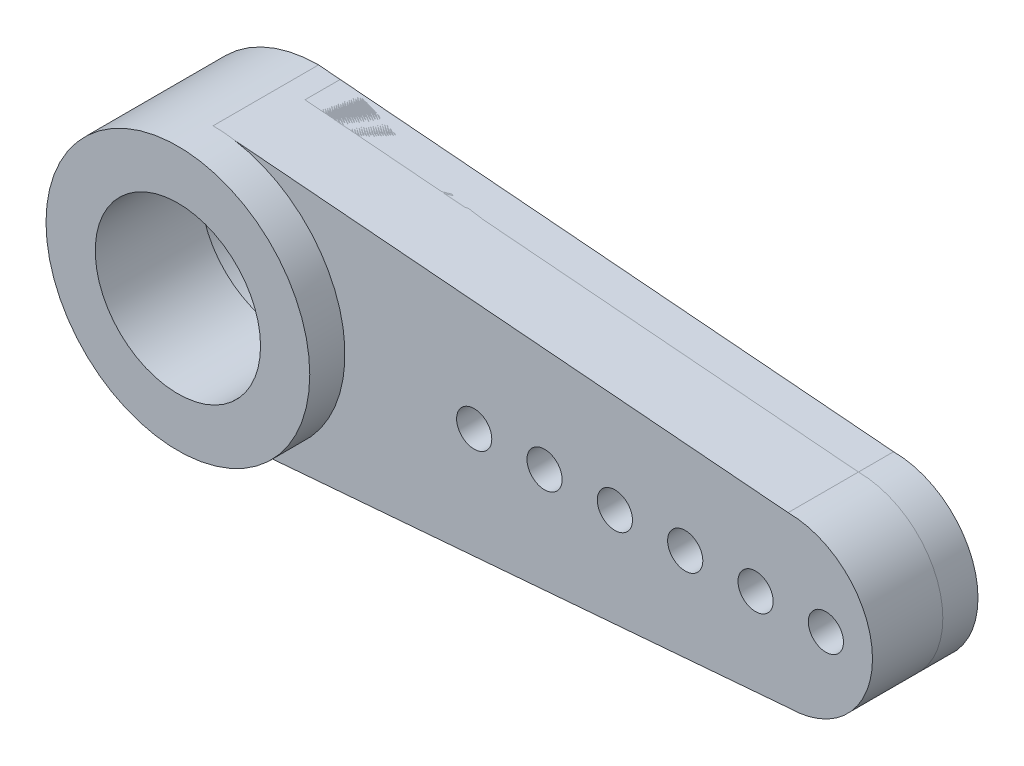
ISO-10303-21;
HEADER;
FILE_DESCRIPTION(('STEP AP214'),'2;1');
FILE_NAME('part.step','',(''),(''),'','','');
FILE_SCHEMA(('AUTOMOTIVE_DESIGN { 1 0 10303 214 1 1 1 1 }'));
ENDSEC;
DATA;
#1=APPLICATION_CONTEXT('core data for automotive mechanical design processes');
#2=APPLICATION_PROTOCOL_DEFINITION('international standard','automotive_design',2000,#1);
#3=PRODUCT_CONTEXT('',#1,'mechanical');
#4=PRODUCT('Part','Part','',(#3));
#5=PRODUCT_RELATED_PRODUCT_CATEGORY('part','',(#4));
#6=PRODUCT_DEFINITION_FORMATION('','',#4);
#7=PRODUCT_DEFINITION_CONTEXT('part definition',#1,'design');
#8=PRODUCT_DEFINITION('design','',#6,#7);
#9=PRODUCT_DEFINITION_SHAPE('','',#8);
#10=(LENGTH_UNIT() NAMED_UNIT(*) SI_UNIT(.MILLI.,.METRE.));
#11=(NAMED_UNIT(*) PLANE_ANGLE_UNIT() SI_UNIT($,.RADIAN.));
#12=(NAMED_UNIT(*) SI_UNIT($,.STERADIAN.) SOLID_ANGLE_UNIT());
#13=UNCERTAINTY_MEASURE_WITH_UNIT(LENGTH_MEASURE(1.E-05),#10,'distance_accuracy_value','');
#14=(GEOMETRIC_REPRESENTATION_CONTEXT(3) GLOBAL_UNCERTAINTY_ASSIGNED_CONTEXT((#13)) GLOBAL_UNIT_ASSIGNED_CONTEXT((#10,
#11,#12)) REPRESENTATION_CONTEXT('',''));
#15=CARTESIAN_POINT('',(0.,0.,0.));
#16=DIRECTION('',(0.,0.,1.));
#17=DIRECTION('',(1.,0.,0.));
#18=AXIS2_PLACEMENT_3D('',#15,#16,#17);
#19=CARTESIAN_POINT('',(2.83275381664821,0.,-20.5860238237002));
#20=DIRECTION('',(0.,0.,1.));
#21=DIRECTION('',(1.,0.,0.));
#22=AXIS2_PLACEMENT_3D('',#19,#20,#21);
#23=CYLINDRICAL_SURFACE('',#22,0.500000000000001);
#24=CARTESIAN_POINT('',(2.83275381664821,0.,0.));
#25=DIRECTION('',(0.,0.,-1.));
#26=DIRECTION('',(-1.,0.,0.));
#27=AXIS2_PLACEMENT_3D('',#24,#25,#26);
#28=CIRCLE('',#27,0.500000000000001);
#29=CARTESIAN_POINT('',(2.33275381664821,0.,0.));
#30=VERTEX_POINT('',#29);
#31=EDGE_CURVE('E134',#30,#30,#28,.T.);
#32=ORIENTED_EDGE('',*,*,#31,.F.);
#33=EDGE_LOOP('',(#32));
#34=FACE_BOUND('',#33,.T.);
#35=CARTESIAN_POINT('',(2.83275381664821,0.,-1.));
#36=DIRECTION('',(0.,0.,-1.));
#37=DIRECTION('',(-1.,0.,0.));
#38=AXIS2_PLACEMENT_3D('',#35,#36,#37);
#39=CIRCLE('',#38,0.500000000000001);
#40=CARTESIAN_POINT('',(2.33275381664821,0.,-1.));
#41=VERTEX_POINT('',#40);
#42=EDGE_CURVE('E199',#41,#41,#39,.T.);
#43=ORIENTED_EDGE('',*,*,#42,.T.);
#44=EDGE_LOOP('',(#43));
#45=FACE_BOUND('',#44,.T.);
#46=ADVANCED_FACE('F54',(#34,#45),#23,.F.);
#47=CARTESIAN_POINT('',(4.8327538166482,0.,-20.5860238237002));
#48=DIRECTION('',(0.,0.,1.));
#49=DIRECTION('',(1.,0.,0.));
#50=AXIS2_PLACEMENT_3D('',#47,#48,#49);
#51=CYLINDRICAL_SURFACE('',#50,0.500000000000001);
#52=CARTESIAN_POINT('',(4.8327538166482,0.,0.));
#53=DIRECTION('',(0.,0.,-1.));
#54=DIRECTION('',(-1.,0.,0.));
#55=AXIS2_PLACEMENT_3D('',#52,#53,#54);
#56=CIRCLE('',#55,0.500000000000001);
#57=CARTESIAN_POINT('',(4.3327538166482,0.,0.));
#58=VERTEX_POINT('',#57);
#59=EDGE_CURVE('E138',#58,#58,#56,.T.);
#60=ORIENTED_EDGE('',*,*,#59,.F.);
#61=EDGE_LOOP('',(#60));
#62=FACE_BOUND('',#61,.T.);
#63=CARTESIAN_POINT('',(4.8327538166482,0.,-1.));
#64=DIRECTION('',(0.,0.,-1.));
#65=DIRECTION('',(-1.,0.,0.));
#66=AXIS2_PLACEMENT_3D('',#63,#64,#65);
#67=CIRCLE('',#66,0.500000000000001);
#68=CARTESIAN_POINT('',(4.3327538166482,0.,-1.));
#69=VERTEX_POINT('',#68);
#70=EDGE_CURVE('E203',#69,#69,#67,.T.);
#71=ORIENTED_EDGE('',*,*,#70,.T.);
#72=EDGE_LOOP('',(#71));
#73=FACE_BOUND('',#72,.T.);
#74=ADVANCED_FACE('F240',(#62,#73),#51,.F.);
#75=CARTESIAN_POINT('',(6.8327538166482,0.,-20.5860238237002));
#76=DIRECTION('',(0.,0.,1.));
#77=DIRECTION('',(1.,0.,0.));
#78=AXIS2_PLACEMENT_3D('',#75,#76,#77);
#79=CYLINDRICAL_SURFACE('',#78,0.500000000000001);
#80=CARTESIAN_POINT('',(6.8327538166482,0.,0.));
#81=DIRECTION('',(0.,0.,-1.));
#82=DIRECTION('',(-1.,0.,0.));
#83=AXIS2_PLACEMENT_3D('',#80,#81,#82);
#84=CIRCLE('',#83,0.500000000000001);
#85=CARTESIAN_POINT('',(6.3327538166482,0.,0.));
#86=VERTEX_POINT('',#85);
#87=EDGE_CURVE('E142',#86,#86,#84,.T.);
#88=ORIENTED_EDGE('',*,*,#87,.F.);
#89=EDGE_LOOP('',(#88));
#90=FACE_BOUND('',#89,.T.);
#91=CARTESIAN_POINT('',(6.8327538166482,0.,-1.));
#92=DIRECTION('',(0.,0.,-1.));
#93=DIRECTION('',(-1.,0.,0.));
#94=AXIS2_PLACEMENT_3D('',#91,#92,#93);
#95=CIRCLE('',#94,0.500000000000001);
#96=CARTESIAN_POINT('',(6.3327538166482,0.,-1.));
#97=VERTEX_POINT('',#96);
#98=EDGE_CURVE('E210',#97,#97,#95,.T.);
#99=ORIENTED_EDGE('',*,*,#98,.T.);
#100=EDGE_LOOP('',(#99));
#101=FACE_BOUND('',#100,.T.);
#102=ADVANCED_FACE('F236',(#90,#101),#79,.F.);
#103=CARTESIAN_POINT('',(8.83275381664821,0.,-20.5860238237002));
#104=DIRECTION('',(0.,0.,1.));
#105=DIRECTION('',(1.,0.,0.));
#106=AXIS2_PLACEMENT_3D('',#103,#104,#105);
#107=CYLINDRICAL_SURFACE('',#106,0.500000000000001);
#108=CARTESIAN_POINT('',(8.83275381664821,0.,0.));
#109=DIRECTION('',(0.,0.,-1.));
#110=DIRECTION('',(-1.,0.,0.));
#111=AXIS2_PLACEMENT_3D('',#108,#109,#110);
#112=CIRCLE('',#111,0.500000000000001);
#113=CARTESIAN_POINT('',(8.33275381664821,0.,0.));
#114=VERTEX_POINT('',#113);
#115=EDGE_CURVE('E146',#114,#114,#112,.T.);
#116=ORIENTED_EDGE('',*,*,#115,.F.);
#117=EDGE_LOOP('',(#116));
#118=FACE_BOUND('',#117,.T.);
#119=CARTESIAN_POINT('',(8.83275381664821,0.,-1.));
#120=DIRECTION('',(0.,0.,-1.));
#121=DIRECTION('',(-1.,0.,0.));
#122=AXIS2_PLACEMENT_3D('',#119,#120,#121);
#123=CIRCLE('',#122,0.500000000000001);
#124=CARTESIAN_POINT('',(8.33275381664821,0.,-1.));
#125=VERTEX_POINT('',#124);
#126=EDGE_CURVE('E125',#125,#125,#123,.T.);
#127=ORIENTED_EDGE('',*,*,#126,.T.);
#128=EDGE_LOOP('',(#127));
#129=FACE_BOUND('',#128,.T.);
#130=ADVANCED_FACE('F220',(#118,#129),#107,.F.);
#131=CARTESIAN_POINT('',(10.8327538166482,0.,-20.5860238237002));
#132=DIRECTION('',(0.,0.,1.));
#133=DIRECTION('',(1.,0.,0.));
#134=AXIS2_PLACEMENT_3D('',#131,#132,#133);
#135=CYLINDRICAL_SURFACE('',#134,0.500000000000001);
#136=CARTESIAN_POINT('',(10.8327538166482,0.,0.));
#137=DIRECTION('',(0.,0.,-1.));
#138=DIRECTION('',(-1.,0.,0.));
#139=AXIS2_PLACEMENT_3D('',#136,#137,#138);
#140=CIRCLE('',#139,0.500000000000001);
#141=CARTESIAN_POINT('',(10.3327538166482,0.,0.));
#142=VERTEX_POINT('',#141);
#143=EDGE_CURVE('E150',#142,#142,#140,.T.);
#144=ORIENTED_EDGE('',*,*,#143,.F.);
#145=EDGE_LOOP('',(#144));
#146=FACE_BOUND('',#145,.T.);
#147=CARTESIAN_POINT('',(10.8327538166482,0.,-1.));
#148=DIRECTION('',(0.,0.,-1.));
#149=DIRECTION('',(-1.,0.,0.));
#150=AXIS2_PLACEMENT_3D('',#147,#148,#149);
#151=CIRCLE('',#150,0.500000000000001);
#152=CARTESIAN_POINT('',(10.3327538166482,0.,-1.));
#153=VERTEX_POINT('',#152);
#154=EDGE_CURVE('E118',#153,#153,#151,.T.);
#155=ORIENTED_EDGE('',*,*,#154,.T.);
#156=EDGE_LOOP('',(#155));
#157=FACE_BOUND('',#156,.T.);
#158=ADVANCED_FACE('F227',(#146,#157),#135,.F.);
#159=CARTESIAN_POINT('',(-0.683125887139327,-3.26206492741271,-20.5860238237002));
#160=DIRECTION('',(-0.0822887775004873,0.996608527505899,0.));
#161=DIRECTION('',(-0.996608527505899,-0.0822887775004873,0.));
#162=AXIS2_PLACEMENT_3D('',#159,#160,#161);
#163=PLANE('',#162);
#164=DIRECTION('',(-0.996608527505899,-0.0822887775004873,0.));
#165=VECTOR('',#164,1.);
#166=CARTESIAN_POINT('',(-0.683125887139327,-3.26206492741271,-1.));
#167=LINE('',#166,#165);
#168=CARTESIAN_POINT('',(9.75743823374803,-2.40000000000001,-1.));
#169=VERTEX_POINT('',#168);
#170=CARTESIAN_POINT('',(-5.97748903593932,-3.69921417823105,-1.));
#171=VERTEX_POINT('',#170);
#172=EDGE_CURVE('E100',#169,#171,#167,.T.);
#173=ORIENTED_EDGE('',*,*,#172,.F.);
#174=DIRECTION('',(0.,0.,1.));
#175=VECTOR('',#174,1.);
#176=CARTESIAN_POINT('',(9.75743823374803,-2.40000000000001,-20.5860238237002));
#177=LINE('',#176,#175);
#178=CARTESIAN_POINT('',(9.75743823374803,-2.40000000000001,0.));
#179=VERTEX_POINT('',#178);
#180=EDGE_CURVE('E71',#169,#179,#177,.T.);
#181=ORIENTED_EDGE('',*,*,#180,.T.);
#182=DIRECTION('',(-0.996608527505898,-0.0822887775004873,0.));
#183=VECTOR('',#182,1.);
#184=CARTESIAN_POINT('',(-0.683125887139327,-3.26206492741271,0.));
#185=LINE('',#184,#183);
#186=CARTESIAN_POINT('',(-5.97748903593932,-3.69921417823105,0.));
#187=VERTEX_POINT('',#186);
#188=EDGE_CURVE('E103',#179,#187,#185,.T.);
#189=ORIENTED_EDGE('',*,*,#188,.T.);
#190=DIRECTION('',(0.,0.,1.));
#191=VECTOR('',#190,1.);
#192=CARTESIAN_POINT('',(-5.97748903593932,-3.69921417823105,-20.5860238237002));
#193=LINE('',#192,#191);
#194=EDGE_CURVE('E96',#171,#187,#193,.T.);
#195=ORIENTED_EDGE('',*,*,#194,.F.);
#196=EDGE_LOOP('',(#173,#181,#189,#195));
#197=FACE_BOUND('',#196,.T.);
#198=ADVANCED_FACE('F98',(#197),#163,.F.);
#199=CARTESIAN_POINT('',(9.75743823374803,0.,-20.5860238237002));
#200=DIRECTION('',(0.,0.,1.));
#201=DIRECTION('',(1.,0.,0.));
#202=AXIS2_PLACEMENT_3D('',#199,#200,#201);
#203=CYLINDRICAL_SURFACE('',#202,2.4);
#204=CARTESIAN_POINT('',(9.75743823374803,0.,-1.));
#205=DIRECTION('',(0.,0.,-1.));
#206=DIRECTION('',(-1.,0.,0.));
#207=AXIS2_PLACEMENT_3D('',#204,#205,#206);
#208=CIRCLE('',#207,2.4);
#209=CARTESIAN_POINT('',(9.75743823374803,2.40000000000001,-1.));
#210=VERTEX_POINT('',#209);
#211=EDGE_CURVE('E116',#210,#169,#208,.T.);
#212=ORIENTED_EDGE('',*,*,#211,.F.);
#213=DIRECTION('',(0.,0.,1.));
#214=VECTOR('',#213,1.);
#215=CARTESIAN_POINT('',(9.75743823374803,2.40000000000001,-20.5860238237002));
#216=LINE('',#215,#214);
#217=CARTESIAN_POINT('',(9.75743823374803,2.40000000000001,0.));
#218=VERTEX_POINT('',#217);
#219=EDGE_CURVE('E64',#210,#218,#216,.T.);
#220=ORIENTED_EDGE('',*,*,#219,.T.);
#221=CARTESIAN_POINT('',(9.75743823374803,0.,0.));
#222=DIRECTION('',(0.,0.,-1.));
#223=DIRECTION('',(-1.,0.,0.));
#224=AXIS2_PLACEMENT_3D('',#221,#222,#223);
#225=CIRCLE('',#224,2.4);
#226=EDGE_CURVE('E161',#218,#179,#225,.T.);
#227=ORIENTED_EDGE('',*,*,#226,.T.);
#228=ORIENTED_EDGE('',*,*,#180,.F.);
#229=EDGE_LOOP('',(#212,#220,#227,#228));
#230=FACE_BOUND('',#229,.T.);
#231=ADVANCED_FACE('F170',(#230),#203,.T.);
#232=CARTESIAN_POINT('',(-0.683125887139327,3.26206492741271,-20.5860238237002));
#233=DIRECTION('',(-0.082288777500487,-0.996608527505899,0.));
#234=DIRECTION('',(0.996608527505899,-0.082288777500487,0.));
#235=AXIS2_PLACEMENT_3D('',#232,#233,#234);
#236=PLANE('',#235);
#237=DIRECTION('',(0.996608527505899,-0.082288777500487,0.));
#238=VECTOR('',#237,1.);
#239=CARTESIAN_POINT('',(-0.683125887139327,3.26206492741271,-1.));
#240=LINE('',#239,#238);
#241=CARTESIAN_POINT('',(-5.97748903593932,3.69921417823105,-1.));
#242=VERTEX_POINT('',#241);
#243=EDGE_CURVE('E78',#242,#210,#240,.T.);
#244=ORIENTED_EDGE('',*,*,#243,.F.);
#245=DIRECTION('',(0.,0.,1.));
#246=VECTOR('',#245,1.);
#247=CARTESIAN_POINT('',(-5.97748903593932,3.69921417823105,-20.5860238237002));
#248=LINE('',#247,#246);
#249=CARTESIAN_POINT('',(-5.97748903593932,3.69921417823105,0.));
#250=VERTEX_POINT('',#249);
#251=EDGE_CURVE('E12',#242,#250,#248,.T.);
#252=ORIENTED_EDGE('',*,*,#251,.T.);
#253=DIRECTION('',(0.996608527505899,-0.082288777500487,0.));
#254=VECTOR('',#253,1.);
#255=CARTESIAN_POINT('',(-0.683125887139327,3.26206492741271,0.));
#256=LINE('',#255,#254);
#257=EDGE_CURVE('E157',#250,#218,#256,.T.);
#258=ORIENTED_EDGE('',*,*,#257,.T.);
#259=ORIENTED_EDGE('',*,*,#219,.F.);
#260=EDGE_LOOP('',(#244,#252,#258,#259));
#261=FACE_BOUND('',#260,.T.);
#262=ADVANCED_FACE('F173',(#261),#236,.F.);
#263=CARTESIAN_POINT('',(-6.59256176625198,0.,-20.5860238237002));
#264=DIRECTION('',(0.,0.,1.));
#265=DIRECTION('',(1.,0.,0.));
#266=AXIS2_PLACEMENT_3D('',#263,#264,#265);
#267=CYLINDRICAL_SURFACE('',#266,3.75);
#268=CARTESIAN_POINT('',(-6.59256176625198,0.,-1.));
#269=DIRECTION('',(0.,0.,-1.));
#270=DIRECTION('',(-1.,0.,0.));
#271=AXIS2_PLACEMENT_3D('',#268,#269,#270);
#272=CIRCLE('',#271,3.75);
#273=EDGE_CURVE('E110',#171,#242,#272,.F.);
#274=ORIENTED_EDGE('',*,*,#273,.F.);
#275=ORIENTED_EDGE('',*,*,#194,.T.);
#276=CARTESIAN_POINT('',(-6.59256176625198,0.,0.));
#277=DIRECTION('',(0.,0.,1.));
#278=DIRECTION('',(-1.,0.,0.));
#279=AXIS2_PLACEMENT_3D('',#276,#277,#278);
#280=CIRCLE('',#279,3.75);
#281=EDGE_CURVE('E154',#187,#250,#280,.T.);
#282=ORIENTED_EDGE('',*,*,#281,.T.);
#283=ORIENTED_EDGE('',*,*,#251,.F.);
#284=EDGE_LOOP('',(#274,#275,#282,#283));
#285=FACE_BOUND('',#284,.T.);
#286=ADVANCED_FACE('F56',(#285),#267,.F.);
#287=CARTESIAN_POINT('',(-6.59256176625198,0.,0.));
#288=DIRECTION('',(0.,0.,-1.));
#289=DIRECTION('',(-1.,0.,0.));
#290=AXIS2_PLACEMENT_3D('',#287,#288,#289);
#291=PLANE('',#290);
#292=ORIENTED_EDGE('',*,*,#281,.F.);
#293=ORIENTED_EDGE('',*,*,#188,.F.);
#294=ORIENTED_EDGE('',*,*,#226,.F.);
#295=ORIENTED_EDGE('',*,*,#257,.F.);
#296=EDGE_LOOP('',(#292,#293,#294,#295));
#297=FACE_BOUND('',#296,.T.);
#298=ORIENTED_EDGE('',*,*,#143,.T.);
#299=EDGE_LOOP('',(#298));
#300=FACE_BOUND('',#299,.T.);
#301=ORIENTED_EDGE('',*,*,#115,.T.);
#302=EDGE_LOOP('',(#301));
#303=FACE_BOUND('',#302,.T.);
#304=ORIENTED_EDGE('',*,*,#87,.T.);
#305=EDGE_LOOP('',(#304));
#306=FACE_BOUND('',#305,.T.);
#307=ORIENTED_EDGE('',*,*,#59,.T.);
#308=EDGE_LOOP('',(#307));
#309=FACE_BOUND('',#308,.T.);
#310=ORIENTED_EDGE('',*,*,#31,.T.);
#311=EDGE_LOOP('',(#310));
#312=FACE_BOUND('',#311,.T.);
#313=CARTESIAN_POINT('',(0.832753816648213,0.,0.));
#314=DIRECTION('',(0.,0.,-1.));
#315=DIRECTION('',(-1.,0.,0.));
#316=AXIS2_PLACEMENT_3D('',#313,#314,#315);
#317=CIRCLE('',#316,0.500000000000001);
#318=CARTESIAN_POINT('',(0.332753816648212,0.,0.));
#319=VERTEX_POINT('',#318);
#320=EDGE_CURVE('E113',#319,#319,#317,.T.);
#321=ORIENTED_EDGE('',*,*,#320,.T.);
#322=EDGE_LOOP('',(#321));
#323=FACE_BOUND('',#322,.T.);
#324=ADVANCED_FACE('F175',(#297,#300,#303,#306,#309,#312,#323),#291,.F.);
#325=CARTESIAN_POINT('',(0.832753816648213,0.,-20.5860238237002));
#326=DIRECTION('',(0.,0.,1.));
#327=DIRECTION('',(1.,0.,0.));
#328=AXIS2_PLACEMENT_3D('',#325,#326,#327);
#329=CYLINDRICAL_SURFACE('',#328,0.500000000000001);
#330=ORIENTED_EDGE('',*,*,#320,.F.);
#331=EDGE_LOOP('',(#330));
#332=FACE_BOUND('',#331,.T.);
#333=CARTESIAN_POINT('',(0.832753816648213,0.,-1.));
#334=DIRECTION('',(0.,0.,-1.));
#335=DIRECTION('',(-1.,0.,0.));
#336=AXIS2_PLACEMENT_3D('',#333,#334,#335);
#337=CIRCLE('',#336,0.500000000000001);
#338=CARTESIAN_POINT('',(0.332753816648212,0.,-1.));
#339=VERTEX_POINT('',#338);
#340=EDGE_CURVE('E58',#339,#339,#337,.T.);
#341=ORIENTED_EDGE('',*,*,#340,.T.);
#342=EDGE_LOOP('',(#341));
#343=FACE_BOUND('',#342,.T.);
#344=ADVANCED_FACE('F178',(#332,#343),#329,.F.);
#345=CARTESIAN_POINT('',(0.,0.,-1.));
#346=DIRECTION('',(0.,0.,-1.));
#347=DIRECTION('',(-1.,0.,0.));
#348=AXIS2_PLACEMENT_3D('',#345,#346,#347);
#349=PLANE('',#348);
#350=ORIENTED_EDGE('',*,*,#340,.F.);
#351=EDGE_LOOP('',(#350));
#352=FACE_BOUND('',#351,.T.);
#353=ORIENTED_EDGE('',*,*,#42,.F.);
#354=EDGE_LOOP('',(#353));
#355=FACE_BOUND('',#354,.T.);
#356=ORIENTED_EDGE('',*,*,#70,.F.);
#357=EDGE_LOOP('',(#356));
#358=FACE_BOUND('',#357,.T.);
#359=ORIENTED_EDGE('',*,*,#98,.F.);
#360=EDGE_LOOP('',(#359));
#361=FACE_BOUND('',#360,.T.);
#362=ORIENTED_EDGE('',*,*,#126,.F.);
#363=EDGE_LOOP('',(#362));
#364=FACE_BOUND('',#363,.T.);
#365=ORIENTED_EDGE('',*,*,#154,.F.);
#366=EDGE_LOOP('',(#365));
#367=FACE_BOUND('',#366,.T.);
#368=ORIENTED_EDGE('',*,*,#172,.T.);
#369=ORIENTED_EDGE('',*,*,#273,.T.);
#370=ORIENTED_EDGE('',*,*,#243,.T.);
#371=ORIENTED_EDGE('',*,*,#211,.T.);
#372=EDGE_LOOP('',(#368,#369,#370,#371));
#373=FACE_BOUND('',#372,.T.);
#374=ADVANCED_FACE('F115',(#352,#355,#358,#361,#364,#367,#373),#349,.T.);
#375=CLOSED_SHELL('',(#46,#74,#102,#130,#158,#198,#231,#262,#286,#324,#344,#374));
#376=MANIFOLD_SOLID_BREP('B2',#375);
#377=CARTESIAN_POINT('',(0.,0.,0.));
#378=DIRECTION('',(0.,0.,1.));
#379=DIRECTION('',(1.,0.,0.));
#380=AXIS2_PLACEMENT_3D('',#377,#378,#379);
#381=PLANE('',#380);
#382=CARTESIAN_POINT('',(-6.59256176625198,0.,0.));
#383=DIRECTION('',(0.,0.,1.));
#384=DIRECTION('',(1.,0.,0.));
#385=AXIS2_PLACEMENT_3D('',#382,#383,#384);
#386=CIRCLE('',#385,2.35);
#387=CARTESIAN_POINT('',(-4.24256176625197,0.,0.));
#388=VERTEX_POINT('',#387);
#389=EDGE_CURVE('E487',#388,#388,#386,.T.);
#390=ORIENTED_EDGE('',*,*,#389,.T.);
#391=EDGE_LOOP('',(#390));
#392=FACE_BOUND('',#391,.T.);
#393=CARTESIAN_POINT('',(-6.59256176625198,0.,0.));
#394=DIRECTION('',(0.,0.,-1.));
#395=DIRECTION('',(-1.,0.,0.));
#396=AXIS2_PLACEMENT_3D('',#393,#394,#395);
#397=CIRCLE('',#396,2.75);
#398=CARTESIAN_POINT('',(-9.34256176625198,0.,0.));
#399=VERTEX_POINT('',#398);
#400=EDGE_CURVE('E474',#399,#399,#397,.T.);
#401=ORIENTED_EDGE('',*,*,#400,.T.);
#402=EDGE_LOOP('',(#401));
#403=FACE_BOUND('',#402,.T.);
#404=ADVANCED_FACE('F381',(#392,#403),#381,.F.);
#405=CARTESIAN_POINT('',(0.262895209574787,-3.18395309373909,2.));
#406=DIRECTION('',(-0.082288777500487,0.996608527505898,0.));
#407=DIRECTION('',(-0.996608527505899,-0.082288777500487,0.));
#408=AXIS2_PLACEMENT_3D('',#405,#406,#407);
#409=PLANE('',#408);
#410=DIRECTION('',(0.,0.,-1.));
#411=VECTOR('',#410,1.);
#412=CARTESIAN_POINT('',(-6.59256176625198,-3.74999999999998,2.));
#413=LINE('',#412,#411);
#414=CARTESIAN_POINT('',(-6.59256176625198,-3.74999999999998,2.));
#415=VERTEX_POINT('',#414);
#416=CARTESIAN_POINT('',(-6.59256176625198,-3.74999999999998,-1.));
#417=VERTEX_POINT('',#416);
#418=EDGE_CURVE('E506',#415,#417,#413,.T.);
#419=ORIENTED_EDGE('',*,*,#418,.T.);
#420=DIRECTION('',(-0.996608527505899,-0.082288777500487,0.));
#421=VECTOR('',#420,1.);
#422=CARTESIAN_POINT('',(0.262895209574787,-3.18395309373909,-1.));
#423=LINE('',#422,#421);
#424=CARTESIAN_POINT('',(-5.97748903593932,-3.69921417823105,-1.));
#425=VERTEX_POINT('',#424);
#426=EDGE_CURVE('E464',#425,#417,#423,.T.);
#427=ORIENTED_EDGE('',*,*,#426,.F.);
#428=CARTESIAN_POINT('',(-5.97748903593932,-3.69921417823105,-1.));
#429=CARTESIAN_POINT('',(-5.90889890667234,-3.69355077306223,-0.99576303631907));
#430=CARTESIAN_POINT('',(-5.84040693931134,-3.68789547300491,-0.990117624215151));
#431=CARTESIAN_POINT('',(-5.7037084112485,-3.67660843857771,-0.976240847471807));
#432=CARTESIAN_POINT('',(-5.63550175259073,-3.67097669611973,-0.96801045956193));
#433=CARTESIAN_POINT('',(-5.43181465119597,-3.65415849508713,-0.939843550831972));
#434=CARTESIAN_POINT('',(-5.29681389271552,-3.64301164346948,-0.916400273744529));
#435=CARTESIAN_POINT('',(-5.02830009939376,-3.62084077980071,-0.862569100873909));
#436=CARTESIAN_POINT('',(-4.8947865880605,-3.60981672840623,-0.832183500585757));
#437=CARTESIAN_POINT('',(-4.62868968445085,-3.58784542443845,-0.766923580565425));
#438=CARTESIAN_POINT('',(-4.49610776320966,-3.57689829332677,-0.732043352115456));
#439=CARTESIAN_POINT('',(-4.21297015312033,-3.55351995854875,-0.655039928293988));
#440=CARTESIAN_POINT('',(-4.06250543854113,-3.5410962665193,-0.612587519576702));
#441=CARTESIAN_POINT('',(-3.76157540548402,-3.51624883259716,-0.52766307646123));
#442=CARTESIAN_POINT('',(-3.61111008724035,-3.50382509072383,-0.485191041321471));
#443=CARTESIAN_POINT('',(-3.30983970544998,-3.47894955461269,-0.402618319882844));
#444=CARTESIAN_POINT('',(-3.15903588515265,-3.46649786302851,-0.362513150511541));
#445=CARTESIAN_POINT('',(-2.85638854942885,-3.44150863347334,-0.286486684142656));
#446=CARTESIAN_POINT('',(-2.70454517002457,-3.42897110673353,-0.250564850445772));
#447=CARTESIAN_POINT('',(-2.3992254150713,-3.40376121870987,-0.184414258906658));
#448=CARTESIAN_POINT('',(-2.24574596402805,-3.39108860348611,-0.154199573161323));
#449=CARTESIAN_POINT('',(-1.93757639807946,-3.36564340996742,-0.100948744526238));
#450=CARTESIAN_POINT('',(-1.78288658716569,-3.35287085677271,-0.0779108549246135));
#451=CARTESIAN_POINT('',(-1.47108304845632,-3.32712561045725,-0.0400260488982411));
#452=CARTESIAN_POINT('',(-1.31396001596623,-3.31415214905899,-0.0252542451194824));
#453=CARTESIAN_POINT('',(-0.998955176093603,-3.28814257512455,-0.0052219673199838));
#454=CARTESIAN_POINT('',(-0.841072740149918,-3.27510641068883,2.83900751409106E-05));
#455=CARTESIAN_POINT('',(-0.683125887139327,-3.26206492741271,0.));
#456=B_SPLINE_CURVE_WITH_KNOTS('',3,(#428,#429,#430,#431,#432,#433,#434,#435,#436,#437,#438,
#439,#440,#441,#442,#443,#444,#445,#446,#447,#448,#449,#450,#451,#452,#453,#454,#455),
.UNSPECIFIED.,.F.,.F.,(4,2,2,2,2,2,2,2,2,2,2,2,2,4),(0.,0.206828623332871,0.413579190582994,
0.825716254636395,1.2377172413426,1.65026548555027,2.12075724618994,2.59126853869818,
3.06085797279234,3.53038709458113,4.00105923721196,4.47161673647357,4.94638343052673,
5.42165427372986),.UNSPECIFIED.);
#457=CARTESIAN_POINT('',(-0.683125887139327,-3.26206492741271,0.));
#458=VERTEX_POINT('',#457);
#459=EDGE_CURVE('E396',#425,#458,#456,.T.);
#460=ORIENTED_EDGE('',*,*,#459,.T.);
#461=DIRECTION('',(0.996608527505899,0.082288777500487,0.));
#462=VECTOR('',#461,1.);
#463=CARTESIAN_POINT('',(0.262895209574787,-3.18395309373909,0.));
#464=LINE('',#463,#462);
#465=CARTESIAN_POINT('',(9.75743823374803,-2.40000000000001,0.));
#466=VERTEX_POINT('',#465);
#467=EDGE_CURVE('E510',#458,#466,#464,.T.);
#468=ORIENTED_EDGE('',*,*,#467,.T.);
#469=DIRECTION('',(0.,0.,-1.));
#470=VECTOR('',#469,1.);
#471=CARTESIAN_POINT('',(9.75743823374803,-2.40000000000001,2.));
#472=LINE('',#471,#470);
#473=CARTESIAN_POINT('',(9.75743823374803,-2.40000000000001,2.));
#474=VERTEX_POINT('',#473);
#475=EDGE_CURVE('E527',#474,#466,#472,.T.);
#476=ORIENTED_EDGE('',*,*,#475,.F.);
#477=DIRECTION('',(0.996608527505899,0.082288777500487,0.));
#478=VECTOR('',#477,1.);
#479=CARTESIAN_POINT('',(0.262895209574787,-3.18395309373909,2.));
#480=LINE('',#479,#478);
#481=CARTESIAN_POINT('',(-5.97748903593932,-3.69921417823105,2.));
#482=VERTEX_POINT('',#481);
#483=EDGE_CURVE('E498',#482,#474,#480,.T.);
#484=ORIENTED_EDGE('',*,*,#483,.F.);
#485=EDGE_CURVE('E493',#415,#482,#480,.T.);
#486=ORIENTED_EDGE('',*,*,#485,.F.);
#487=EDGE_LOOP('',(#419,#427,#460,#468,#476,#484,#486));
#488=FACE_BOUND('',#487,.T.);
#489=ADVANCED_FACE('F538',(#488),#409,.F.);
#490=CARTESIAN_POINT('',(9.75743823374803,0.,2.));
#491=DIRECTION('',(0.,0.,-1.));
#492=DIRECTION('',(-1.,0.,0.));
#493=AXIS2_PLACEMENT_3D('',#490,#491,#492);
#494=CYLINDRICAL_SURFACE('',#493,2.4);
#495=CARTESIAN_POINT('',(9.75743823374803,0.,0.));
#496=DIRECTION('',(0.,0.,1.));
#497=DIRECTION('',(1.,0.,0.));
#498=AXIS2_PLACEMENT_3D('',#495,#496,#497);
#499=CIRCLE('',#498,2.4);
#500=CARTESIAN_POINT('',(9.75743823374803,2.40000000000001,0.));
#501=VERTEX_POINT('',#500);
#502=EDGE_CURVE('E513',#466,#501,#499,.T.);
#503=ORIENTED_EDGE('',*,*,#502,.T.);
#504=DIRECTION('',(0.,0.,-1.));
#505=VECTOR('',#504,1.);
#506=CARTESIAN_POINT('',(9.75743823374803,2.40000000000001,2.));
#507=LINE('',#506,#505);
#508=CARTESIAN_POINT('',(9.75743823374803,2.40000000000001,2.));
#509=VERTEX_POINT('',#508);
#510=EDGE_CURVE('E524',#509,#501,#507,.T.);
#511=ORIENTED_EDGE('',*,*,#510,.F.);
#512=CARTESIAN_POINT('',(9.75743823374803,0.,2.));
#513=DIRECTION('',(0.,0.,1.));
#514=DIRECTION('',(1.,0.,0.));
#515=AXIS2_PLACEMENT_3D('',#512,#513,#514);
#516=CIRCLE('',#515,2.4);
#517=EDGE_CURVE('E497',#474,#509,#516,.T.);
#518=ORIENTED_EDGE('',*,*,#517,.F.);
#519=ORIENTED_EDGE('',*,*,#475,.T.);
#520=EDGE_LOOP('',(#503,#511,#518,#519));
#521=FACE_BOUND('',#520,.T.);
#522=ADVANCED_FACE('F542',(#521),#494,.T.);
#523=CARTESIAN_POINT('',(0.262895209574787,3.18395309373909,2.));
#524=DIRECTION('',(0.082288777500487,0.996608527505898,0.));
#525=DIRECTION('',(-0.996608527505899,0.082288777500487,0.));
#526=AXIS2_PLACEMENT_3D('',#523,#524,#525);
#527=PLANE('',#526);
#528=DIRECTION('',(0.996608527505899,-0.082288777500487,0.));
#529=VECTOR('',#528,1.);
#530=CARTESIAN_POINT('',(0.262895209574787,3.18395309373909,0.));
#531=LINE('',#530,#529);
#532=CARTESIAN_POINT('',(-0.683125887139327,3.26206492741271,0.));
#533=VERTEX_POINT('',#532);
#534=EDGE_CURVE('E449',#533,#501,#531,.T.);
#535=ORIENTED_EDGE('',*,*,#534,.F.);
#536=CARTESIAN_POINT('',(-0.683125887139327,3.26206492741271,0.));
#537=CARTESIAN_POINT('',(-0.776453659199812,3.26977089024341,1.86031690313964E-06));
#538=CARTESIAN_POINT('',(-0.869768246239267,3.27747576440263,-0.00182470285755777));
#539=CARTESIAN_POINT('',(-1.05624741305677,3.29287312680041,-0.00894643425798204));
#540=CARTESIAN_POINT('',(-1.14941202016776,3.30056561729581,-0.0142408756681171));
#541=CARTESIAN_POINT('',(-1.42822561016541,3.32358692289195,-0.0350204923725467));
#542=CARTESIAN_POINT('',(-1.61352457300247,3.33888683725464,-0.0554033000199392));
#543=CARTESIAN_POINT('',(-1.9821099087611,3.36932048883105,-0.107396644071183));
#544=CARTESIAN_POINT('',(-2.16539960376572,3.38445450034519,-0.138984303077126));
#545=CARTESIAN_POINT('',(-2.53024499453693,3.41457934912445,-0.211289568381174));
#546=CARTESIAN_POINT('',(-2.71179976780432,3.4295701102199,-0.252011777655343));
#547=CARTESIAN_POINT('',(-3.02038647428273,3.45504974653464,-0.327129607218164));
#548=CARTESIAN_POINT('',(-3.14782415889436,3.46557212416314,-0.359888657985518));
#549=CARTESIAN_POINT('',(-3.40211444318963,3.48656856965542,-0.427605519157072));
#550=CARTESIAN_POINT('',(-3.52896704069653,3.49704263733947,-0.462563337734488));
#551=CARTESIAN_POINT('',(-3.78230603425313,3.51796053589002,-0.533399092998491));
#552=CARTESIAN_POINT('',(-3.90879263812572,3.52840438391619,-0.569276294403223));
#553=CARTESIAN_POINT('',(-4.16194032242292,3.54930648628936,-0.640507531752912));
#554=CARTESIAN_POINT('',(-4.28860143065138,3.55976474293208,-0.675861470294161));
#555=CARTESIAN_POINT('',(-4.5433032695077,3.58079516999361,-0.74449915111177));
#556=CARTESIAN_POINT('',(-4.67134771874857,3.59136764745386,-0.777769211583591));
#557=CARTESIAN_POINT('',(-4.92849336098912,3.6125998564462,-0.839934794532193));
#558=CARTESIAN_POINT('',(-5.05759432325192,3.62325956892662,-0.868831246653125));
#559=CARTESIAN_POINT('',(-5.2524992938025,3.63935263988951,-0.90725982126514));
#560=CARTESIAN_POINT('',(-5.31781678433789,3.64474582718142,-0.919270264324894));
#561=CARTESIAN_POINT('',(-5.44877614146757,3.65555898510956,-0.941339569283473));
#562=CARTESIAN_POINT('',(-5.51441798265249,3.66097895364776,-0.951398581646111));
#563=CARTESIAN_POINT('',(-5.64615074999322,3.67185597113461,-0.969322243921884));
#564=CARTESIAN_POINT('',(-5.71224235047344,3.67731307576142,-0.977181960460558));
#565=CARTESIAN_POINT('',(-5.84468913765656,3.68824904901507,-0.990469367033638));
#566=CARTESIAN_POINT('',(-5.91104440553063,3.69372792434411,-0.995896238267156));
#567=CARTESIAN_POINT('',(-5.97748903593932,3.69921417823105,-1.));
#568=B_SPLINE_CURVE_WITH_KNOTS('',3,(#536,#537,#538,#539,#540,#541,#542,#543,#544,#545,#546,
#547,#548,#549,#550,#551,#552,#553,#554,#555,#556,#557,#558,#559,#560,#561,#562,#563,#564,#565,
#566,#567),.UNSPECIFIED.,.F.,.F.,(4,2,2,2,2,2,2,2,2,2,2,2,2,2,2,4),(0.,0.280895826758577,
0.561732800748641,1.12241509307989,1.68195914518313,2.24178579214522,2.63776535897615,
3.03374639782173,3.42942006620094,3.82516648439255,4.22328545892771,4.62131969100483,
4.82118870082107,5.02104229373506,5.22134066082431,5.42170639001788),.UNSPECIFIED.);
#569=CARTESIAN_POINT('',(-5.97748903593932,3.69921417823105,-1.));
#570=VERTEX_POINT('',#569);
#571=EDGE_CURVE('E52',#533,#570,#568,.T.);
#572=ORIENTED_EDGE('',*,*,#571,.T.);
#573=DIRECTION('',(0.996608527505899,-0.082288777500487,0.));
#574=VECTOR('',#573,1.);
#575=CARTESIAN_POINT('',(0.262895209574787,3.18395309373909,-1.));
#576=LINE('',#575,#574);
#577=CARTESIAN_POINT('',(-6.59256176625198,3.74999999999998,-1.));
#578=VERTEX_POINT('',#577);
#579=EDGE_CURVE('E447',#578,#570,#576,.T.);
#580=ORIENTED_EDGE('',*,*,#579,.F.);
#581=DIRECTION('',(0.,0.,-1.));
#582=VECTOR('',#581,1.);
#583=CARTESIAN_POINT('',(-6.59256176625198,3.74999999999998,2.));
#584=LINE('',#583,#582);
#585=CARTESIAN_POINT('',(-6.59256176625198,3.74999999999998,2.));
#586=VERTEX_POINT('',#585);
#587=EDGE_CURVE('E521',#586,#578,#584,.T.);
#588=ORIENTED_EDGE('',*,*,#587,.F.);
#589=DIRECTION('',(0.996608527505899,-0.082288777500487,0.));
#590=VECTOR('',#589,1.);
#591=CARTESIAN_POINT('',(0.262895209574787,3.18395309373909,2.));
#592=LINE('',#591,#590);
#593=CARTESIAN_POINT('',(-5.97748903593932,3.69921417823105,2.));
#594=VERTEX_POINT('',#593);
#595=EDGE_CURVE('E503',#586,#594,#592,.T.);
#596=ORIENTED_EDGE('',*,*,#595,.T.);
#597=EDGE_CURVE('E502',#594,#509,#592,.T.);
#598=ORIENTED_EDGE('',*,*,#597,.T.);
#599=ORIENTED_EDGE('',*,*,#510,.T.);
#600=EDGE_LOOP('',(#535,#572,#580,#588,#596,#598,#599));
#601=FACE_BOUND('',#600,.T.);
#602=ADVANCED_FACE('F446',(#601),#527,.T.);
#603=CARTESIAN_POINT('',(-6.59256176625198,0.,2.));
#604=DIRECTION('',(0.,0.,-1.));
#605=DIRECTION('',(-1.,0.,0.));
#606=AXIS2_PLACEMENT_3D('',#603,#604,#605);
#607=CYLINDRICAL_SURFACE('',#606,2.35);
#608=ORIENTED_EDGE('',*,*,#389,.F.);
#609=EDGE_LOOP('',(#608));
#610=FACE_BOUND('',#609,.T.);
#611=CARTESIAN_POINT('',(-6.59256176625198,0.,3.));
#612=DIRECTION('',(0.,0.,1.));
#613=DIRECTION('',(1.,0.,0.));
#614=AXIS2_PLACEMENT_3D('',#611,#612,#613);
#615=CIRCLE('',#614,2.35);
#616=CARTESIAN_POINT('',(-4.24256176625197,0.,3.));
#617=VERTEX_POINT('',#616);
#618=EDGE_CURVE('E473',#617,#617,#615,.T.);
#619=ORIENTED_EDGE('',*,*,#618,.T.);
#620=EDGE_LOOP('',(#619));
#621=FACE_BOUND('',#620,.T.);
#622=ADVANCED_FACE('F543',(#610,#621),#607,.F.);
#623=CARTESIAN_POINT('',(-6.59256176625198,0.,2.));
#624=DIRECTION('',(0.,0.,-1.));
#625=DIRECTION('',(-1.,0.,0.));
#626=AXIS2_PLACEMENT_3D('',#623,#624,#625);
#627=CYLINDRICAL_SURFACE('',#626,3.75);
#628=ORIENTED_EDGE('',*,*,#587,.T.);
#629=CARTESIAN_POINT('',(-6.59256176625198,0.,-1.));
#630=DIRECTION('',(0.,0.,-1.));
#631=DIRECTION('',(-1.,0.,0.));
#632=AXIS2_PLACEMENT_3D('',#629,#630,#631);
#633=CIRCLE('',#632,3.75);
#634=EDGE_CURVE('E459',#417,#578,#633,.T.);
#635=ORIENTED_EDGE('',*,*,#634,.F.);
#636=ORIENTED_EDGE('',*,*,#418,.F.);
#637=CARTESIAN_POINT('',(-6.59256176625198,0.,2.));
#638=DIRECTION('',(0.,0.,1.));
#639=DIRECTION('',(1.,0.,0.));
#640=AXIS2_PLACEMENT_3D('',#637,#638,#639);
#641=CIRCLE('',#640,3.75);
#642=EDGE_CURVE('E482',#415,#482,#641,.T.);
#643=ORIENTED_EDGE('',*,*,#642,.T.);
#644=EDGE_CURVE('E492',#482,#594,#641,.T.);
#645=ORIENTED_EDGE('',*,*,#644,.T.);
#646=EDGE_CURVE('E488',#594,#586,#641,.T.);
#647=ORIENTED_EDGE('',*,*,#646,.T.);
#648=EDGE_LOOP('',(#628,#635,#636,#643,#645,#647));
#649=FACE_BOUND('',#648,.T.);
#650=CARTESIAN_POINT('',(-6.59256176625198,0.,3.));
#651=DIRECTION('',(0.,0.,1.));
#652=DIRECTION('',(-1.,0.,0.));
#653=AXIS2_PLACEMENT_3D('',#650,#651,#652);
#654=CIRCLE('',#653,3.75);
#655=CARTESIAN_POINT('',(-10.342561766252,0.,3.));
#656=VERTEX_POINT('',#655);
#657=EDGE_CURVE('E483',#656,#656,#654,.T.);
#658=ORIENTED_EDGE('',*,*,#657,.F.);
#659=EDGE_LOOP('',(#658));
#660=FACE_BOUND('',#659,.T.);
#661=ADVANCED_FACE('F545',(#649,#660),#627,.T.);
#662=CARTESIAN_POINT('',(0.,0.,2.));
#663=DIRECTION('',(0.,0.,1.));
#664=DIRECTION('',(1.,0.,0.));
#665=AXIS2_PLACEMENT_3D('',#662,#663,#664);
#666=PLANE('',#665);
#667=CARTESIAN_POINT('',(10.8327538166482,0.,2.));
#668=DIRECTION('',(0.,0.,1.));
#669=DIRECTION('',(1.,0.,0.));
#670=AXIS2_PLACEMENT_3D('',#667,#668,#669);
#671=CIRCLE('',#670,0.500000000000001);
#672=CARTESIAN_POINT('',(11.3327538166482,0.,2.));
#673=VERTEX_POINT('',#672);
#674=EDGE_CURVE('E672',#673,#673,#671,.F.);
#675=ORIENTED_EDGE('',*,*,#674,.T.);
#676=EDGE_LOOP('',(#675));
#677=FACE_BOUND('',#676,.T.);
#678=CARTESIAN_POINT('',(8.83275381664821,0.,2.));
#679=DIRECTION('',(0.,0.,1.));
#680=DIRECTION('',(1.,0.,0.));
#681=AXIS2_PLACEMENT_3D('',#678,#679,#680);
#682=CIRCLE('',#681,0.500000000000001);
#683=CARTESIAN_POINT('',(9.33275381664821,0.,2.));
#684=VERTEX_POINT('',#683);
#685=EDGE_CURVE('E681',#684,#684,#682,.F.);
#686=ORIENTED_EDGE('',*,*,#685,.T.);
#687=EDGE_LOOP('',(#686));
#688=FACE_BOUND('',#687,.T.);
#689=CARTESIAN_POINT('',(6.8327538166482,0.,2.));
#690=DIRECTION('',(0.,0.,1.));
#691=DIRECTION('',(1.,0.,0.));
#692=AXIS2_PLACEMENT_3D('',#689,#690,#691);
#693=CIRCLE('',#692,0.500000000000001);
#694=CARTESIAN_POINT('',(7.3327538166482,0.,2.));
#695=VERTEX_POINT('',#694);
#696=EDGE_CURVE('E687',#695,#695,#693,.F.);
#697=ORIENTED_EDGE('',*,*,#696,.T.);
#698=EDGE_LOOP('',(#697));
#699=FACE_BOUND('',#698,.T.);
#700=CARTESIAN_POINT('',(4.8327538166482,0.,2.));
#701=DIRECTION('',(0.,0.,1.));
#702=DIRECTION('',(1.,0.,0.));
#703=AXIS2_PLACEMENT_3D('',#700,#701,#702);
#704=CIRCLE('',#703,0.500000000000001);
#705=CARTESIAN_POINT('',(5.3327538166482,0.,2.));
#706=VERTEX_POINT('',#705);
#707=EDGE_CURVE('E693',#706,#706,#704,.F.);
#708=ORIENTED_EDGE('',*,*,#707,.T.);
#709=EDGE_LOOP('',(#708));
#710=FACE_BOUND('',#709,.T.);
#711=CARTESIAN_POINT('',(2.83275381664821,0.,2.));
#712=DIRECTION('',(0.,0.,1.));
#713=DIRECTION('',(1.,0.,0.));
#714=AXIS2_PLACEMENT_3D('',#711,#712,#713);
#715=CIRCLE('',#714,0.500000000000001);
#716=CARTESIAN_POINT('',(3.33275381664822,0.,2.));
#717=VERTEX_POINT('',#716);
#718=EDGE_CURVE('E699',#717,#717,#715,.F.);
#719=ORIENTED_EDGE('',*,*,#718,.T.);
#720=EDGE_LOOP('',(#719));
#721=FACE_BOUND('',#720,.T.);
#722=CARTESIAN_POINT('',(0.832753816648213,0.,2.));
#723=DIRECTION('',(0.,0.,1.));
#724=DIRECTION('',(1.,0.,0.));
#725=AXIS2_PLACEMENT_3D('',#722,#723,#724);
#726=CIRCLE('',#725,0.500000000000001);
#727=CARTESIAN_POINT('',(1.33275381664821,0.,2.));
#728=VERTEX_POINT('',#727);
#729=EDGE_CURVE('E705',#728,#728,#726,.F.);
#730=ORIENTED_EDGE('',*,*,#729,.T.);
#731=EDGE_LOOP('',(#730));
#732=FACE_BOUND('',#731,.T.);
#733=ORIENTED_EDGE('',*,*,#644,.F.);
#734=ORIENTED_EDGE('',*,*,#483,.T.);
#735=ORIENTED_EDGE('',*,*,#517,.T.);
#736=ORIENTED_EDGE('',*,*,#597,.F.);
#737=EDGE_LOOP('',(#733,#734,#735,#736));
#738=FACE_BOUND('',#737,.T.);
#739=ADVANCED_FACE('F551',(#677,#688,#699,#710,#721,#732,#738),#666,.T.);
#740=CARTESIAN_POINT('',(10.8327538166482,0.,0.));
#741=DIRECTION('',(0.,0.,-1.));
#742=DIRECTION('',(-1.,0.,0.));
#743=AXIS2_PLACEMENT_3D('',#740,#741,#742);
#744=CIRCLE('',#743,0.500000000000001);
#745=CARTESIAN_POINT('',(10.3327538166482,0.,0.));
#746=VERTEX_POINT('',#745);
#747=EDGE_CURVE('E478',#746,#746,#744,.T.);
#748=ORIENTED_EDGE('',*,*,#747,.F.);
#749=EDGE_LOOP('',(#748));
#750=FACE_BOUND('',#749,.T.);
#751=CARTESIAN_POINT('',(8.83275381664821,0.,0.));
#752=DIRECTION('',(0.,0.,-1.));
#753=DIRECTION('',(-1.,0.,0.));
#754=AXIS2_PLACEMENT_3D('',#751,#752,#753);
#755=CIRCLE('',#754,0.500000000000001);
#756=CARTESIAN_POINT('',(8.33275381664821,0.,0.));
#757=VERTEX_POINT('',#756);
#758=EDGE_CURVE('E582',#757,#757,#755,.T.);
#759=ORIENTED_EDGE('',*,*,#758,.F.);
#760=EDGE_LOOP('',(#759));
#761=FACE_BOUND('',#760,.T.);
#762=CARTESIAN_POINT('',(6.8327538166482,0.,0.));
#763=DIRECTION('',(0.,0.,-1.));
#764=DIRECTION('',(-1.,0.,0.));
#765=AXIS2_PLACEMENT_3D('',#762,#763,#764);
#766=CIRCLE('',#765,0.500000000000001);
#767=CARTESIAN_POINT('',(6.3327538166482,0.,0.));
#768=VERTEX_POINT('',#767);
#769=EDGE_CURVE('E586',#768,#768,#766,.T.);
#770=ORIENTED_EDGE('',*,*,#769,.F.);
#771=EDGE_LOOP('',(#770));
#772=FACE_BOUND('',#771,.T.);
#773=CARTESIAN_POINT('',(4.8327538166482,0.,0.));
#774=DIRECTION('',(0.,0.,-1.));
#775=DIRECTION('',(-1.,0.,0.));
#776=AXIS2_PLACEMENT_3D('',#773,#774,#775);
#777=CIRCLE('',#776,0.500000000000001);
#778=CARTESIAN_POINT('',(4.3327538166482,0.,0.));
#779=VERTEX_POINT('',#778);
#780=EDGE_CURVE('E590',#779,#779,#777,.T.);
#781=ORIENTED_EDGE('',*,*,#780,.F.);
#782=EDGE_LOOP('',(#781));
#783=FACE_BOUND('',#782,.T.);
#784=CARTESIAN_POINT('',(2.83275381664821,0.,0.));
#785=DIRECTION('',(0.,0.,-1.));
#786=DIRECTION('',(-1.,0.,0.));
#787=AXIS2_PLACEMENT_3D('',#784,#785,#786);
#788=CIRCLE('',#787,0.500000000000001);
#789=CARTESIAN_POINT('',(2.33275381664821,0.,0.));
#790=VERTEX_POINT('',#789);
#791=EDGE_CURVE('E594',#790,#790,#788,.T.);
#792=ORIENTED_EDGE('',*,*,#791,.F.);
#793=EDGE_LOOP('',(#792));
#794=FACE_BOUND('',#793,.T.);
#795=CARTESIAN_POINT('',(0.832753816648213,0.,0.));
#796=DIRECTION('',(0.,0.,-1.));
#797=DIRECTION('',(-1.,0.,0.));
#798=AXIS2_PLACEMENT_3D('',#795,#796,#797);
#799=CIRCLE('',#798,0.500000000000001);
#800=CARTESIAN_POINT('',(0.332753816648212,0.,0.));
#801=VERTEX_POINT('',#800);
#802=EDGE_CURVE('E597',#801,#801,#799,.T.);
#803=ORIENTED_EDGE('',*,*,#802,.F.);
#804=EDGE_LOOP('',(#803));
#805=FACE_BOUND('',#804,.T.);
#806=ORIENTED_EDGE('',*,*,#467,.F.);
#807=CARTESIAN_POINT('',(-6.59256176625198,0.,0.));
#808=DIRECTION('',(0.,0.,1.));
#809=DIRECTION('',(1.,0.,0.));
#810=AXIS2_PLACEMENT_3D('',#807,#808,#809);
#811=CIRCLE('',#810,6.75);
#812=EDGE_CURVE('E409',#458,#533,#811,.T.);
#813=ORIENTED_EDGE('',*,*,#812,.T.);
#814=ORIENTED_EDGE('',*,*,#534,.T.);
#815=ORIENTED_EDGE('',*,*,#502,.F.);
#816=EDGE_LOOP('',(#806,#813,#814,#815));
#817=FACE_BOUND('',#816,.T.);
#818=ADVANCED_FACE('F559',(#750,#761,#772,#783,#794,#805,#817),#381,.F.);
#819=CARTESIAN_POINT('',(-6.59256176625198,0.,2.));
#820=DIRECTION('',(0.,0.,-1.));
#821=DIRECTION('',(-1.,0.,0.));
#822=AXIS2_PLACEMENT_3D('',#819,#820,#821);
#823=PLANE('',#822);
#824=ORIENTED_EDGE('',*,*,#595,.F.);
#825=ORIENTED_EDGE('',*,*,#646,.F.);
#826=EDGE_LOOP('',(#824,#825));
#827=FACE_BOUND('',#826,.T.);
#828=ADVANCED_FACE('F565',(#827),#823,.T.);
#829=CARTESIAN_POINT('',(-6.59256176625198,0.,3.));
#830=DIRECTION('',(0.,0.,-1.));
#831=DIRECTION('',(-1.,0.,0.));
#832=AXIS2_PLACEMENT_3D('',#829,#830,#831);
#833=PLANE('',#832);
#834=ORIENTED_EDGE('',*,*,#657,.T.);
#835=EDGE_LOOP('',(#834));
#836=FACE_BOUND('',#835,.T.);
#837=ORIENTED_EDGE('',*,*,#618,.F.);
#838=EDGE_LOOP('',(#837));
#839=FACE_BOUND('',#838,.T.);
#840=ADVANCED_FACE('F571',(#836,#839),#833,.F.);
#841=ORIENTED_EDGE('',*,*,#642,.F.);
#842=ORIENTED_EDGE('',*,*,#485,.T.);
#843=EDGE_LOOP('',(#841,#842));
#844=FACE_BOUND('',#843,.T.);
#845=ADVANCED_FACE('F574',(#844),#823,.T.);
#846=CARTESIAN_POINT('',(-6.59256176625198,0.,-1.));
#847=DIRECTION('',(0.,0.,1.));
#848=DIRECTION('',(1.,0.,0.));
#849=AXIS2_PLACEMENT_3D('',#846,#847,#848);
#850=CYLINDRICAL_SURFACE('',#849,2.75);
#851=CARTESIAN_POINT('',(-6.59256176625198,0.,-1.));
#852=DIRECTION('',(0.,0.,-1.));
#853=DIRECTION('',(-1.,0.,0.));
#854=AXIS2_PLACEMENT_3D('',#851,#852,#853);
#855=CIRCLE('',#854,2.75);
#856=CARTESIAN_POINT('',(-9.34256176625198,0.,-1.));
#857=VERTEX_POINT('',#856);
#858=EDGE_CURVE('E461',#857,#857,#855,.T.);
#859=ORIENTED_EDGE('',*,*,#858,.T.);
#860=EDGE_LOOP('',(#859));
#861=FACE_BOUND('',#860,.T.);
#862=ORIENTED_EDGE('',*,*,#400,.F.);
#863=EDGE_LOOP('',(#862));
#864=FACE_BOUND('',#863,.T.);
#865=ADVANCED_FACE('F631',(#861,#864),#850,.F.);
#866=CARTESIAN_POINT('',(0.,0.,-1.));
#867=DIRECTION('',(0.,0.,-1.));
#868=DIRECTION('',(-1.,0.,0.));
#869=AXIS2_PLACEMENT_3D('',#866,#867,#868);
#870=PLANE('',#869);
#871=ORIENTED_EDGE('',*,*,#858,.F.);
#872=EDGE_LOOP('',(#871));
#873=FACE_BOUND('',#872,.T.);
#874=ORIENTED_EDGE('',*,*,#579,.T.);
#875=CARTESIAN_POINT('',(-6.59256176625198,0.,-1.));
#876=DIRECTION('',(0.,0.,-1.));
#877=DIRECTION('',(-1.,0.,0.));
#878=AXIS2_PLACEMENT_3D('',#875,#876,#877);
#879=CIRCLE('',#878,3.75);
#880=EDGE_CURVE('E457',#570,#425,#879,.T.);
#881=ORIENTED_EDGE('',*,*,#880,.T.);
#882=ORIENTED_EDGE('',*,*,#426,.T.);
#883=ORIENTED_EDGE('',*,*,#634,.T.);
#884=EDGE_LOOP('',(#874,#881,#882,#883));
#885=FACE_BOUND('',#884,.T.);
#886=ADVANCED_FACE('F455',(#873,#885),#870,.T.);
#887=CARTESIAN_POINT('',(-6.59256176625198,0.,-5.));
#888=DIRECTION('',(0.,0.,1.));
#889=DIRECTION('',(1.,0.,0.));
#890=AXIS2_PLACEMENT_3D('',#887,#888,#889);
#891=TOROIDAL_SURFACE('',#890,6.75,5.);
#892=ORIENTED_EDGE('',*,*,#571,.F.);
#893=ORIENTED_EDGE('',*,*,#812,.F.);
#894=ORIENTED_EDGE('',*,*,#459,.F.);
#895=ORIENTED_EDGE('',*,*,#880,.F.);
#896=EDGE_LOOP('',(#892,#893,#894,#895));
#897=FACE_BOUND('',#896,.T.);
#898=ADVANCED_FACE('F383',(#897),#891,.F.);
#899=CARTESIAN_POINT('',(0.832753816648213,0.,3.001));
#900=DIRECTION('',(0.,0.,-1.));
#901=DIRECTION('',(-1.,0.,0.));
#902=AXIS2_PLACEMENT_3D('',#899,#900,#901);
#903=CYLINDRICAL_SURFACE('',#902,0.500000000000001);
#904=ORIENTED_EDGE('',*,*,#729,.F.);
#905=EDGE_LOOP('',(#904));
#906=FACE_BOUND('',#905,.T.);
#907=ORIENTED_EDGE('',*,*,#802,.T.);
#908=EDGE_LOOP('',(#907));
#909=FACE_BOUND('',#908,.T.);
#910=ADVANCED_FACE('F644',(#906,#909),#903,.F.);
#911=CARTESIAN_POINT('',(2.83275381664821,0.,3.001));
#912=DIRECTION('',(0.,0.,-1.));
#913=DIRECTION('',(-1.,0.,0.));
#914=AXIS2_PLACEMENT_3D('',#911,#912,#913);
#915=CYLINDRICAL_SURFACE('',#914,0.500000000000001);
#916=ORIENTED_EDGE('',*,*,#718,.F.);
#917=EDGE_LOOP('',(#916));
#918=FACE_BOUND('',#917,.T.);
#919=ORIENTED_EDGE('',*,*,#791,.T.);
#920=EDGE_LOOP('',(#919));
#921=FACE_BOUND('',#920,.T.);
#922=ADVANCED_FACE('F647',(#918,#921),#915,.F.);
#923=CARTESIAN_POINT('',(4.8327538166482,0.,3.001));
#924=DIRECTION('',(0.,0.,-1.));
#925=DIRECTION('',(-1.,0.,0.));
#926=AXIS2_PLACEMENT_3D('',#923,#924,#925);
#927=CYLINDRICAL_SURFACE('',#926,0.500000000000001);
#928=ORIENTED_EDGE('',*,*,#707,.F.);
#929=EDGE_LOOP('',(#928));
#930=FACE_BOUND('',#929,.T.);
#931=ORIENTED_EDGE('',*,*,#780,.T.);
#932=EDGE_LOOP('',(#931));
#933=FACE_BOUND('',#932,.T.);
#934=ADVANCED_FACE('F651',(#930,#933),#927,.F.);
#935=CARTESIAN_POINT('',(6.8327538166482,0.,3.001));
#936=DIRECTION('',(0.,0.,-1.));
#937=DIRECTION('',(-1.,0.,0.));
#938=AXIS2_PLACEMENT_3D('',#935,#936,#937);
#939=CYLINDRICAL_SURFACE('',#938,0.500000000000001);
#940=ORIENTED_EDGE('',*,*,#696,.F.);
#941=EDGE_LOOP('',(#940));
#942=FACE_BOUND('',#941,.T.);
#943=ORIENTED_EDGE('',*,*,#769,.T.);
#944=EDGE_LOOP('',(#943));
#945=FACE_BOUND('',#944,.T.);
#946=ADVANCED_FACE('F655',(#942,#945),#939,.F.);
#947=CARTESIAN_POINT('',(8.83275381664821,0.,3.001));
#948=DIRECTION('',(0.,0.,-1.));
#949=DIRECTION('',(-1.,0.,0.));
#950=AXIS2_PLACEMENT_3D('',#947,#948,#949);
#951=CYLINDRICAL_SURFACE('',#950,0.500000000000001);
#952=ORIENTED_EDGE('',*,*,#685,.F.);
#953=EDGE_LOOP('',(#952));
#954=FACE_BOUND('',#953,.T.);
#955=ORIENTED_EDGE('',*,*,#758,.T.);
#956=EDGE_LOOP('',(#955));
#957=FACE_BOUND('',#956,.T.);
#958=ADVANCED_FACE('F659',(#954,#957),#951,.F.);
#959=CARTESIAN_POINT('',(10.8327538166482,0.,3.001));
#960=DIRECTION('',(0.,0.,-1.));
#961=DIRECTION('',(-1.,0.,0.));
#962=AXIS2_PLACEMENT_3D('',#959,#960,#961);
#963=CYLINDRICAL_SURFACE('',#962,0.500000000000001);
#964=ORIENTED_EDGE('',*,*,#674,.F.);
#965=EDGE_LOOP('',(#964));
#966=FACE_BOUND('',#965,.T.);
#967=ORIENTED_EDGE('',*,*,#747,.T.);
#968=EDGE_LOOP('',(#967));
#969=FACE_BOUND('',#968,.T.);
#970=ADVANCED_FACE('F663',(#966,#969),#963,.F.);
#971=CLOSED_SHELL('',(#404,#489,#522,#602,#622,#661,#739,#818,#828,#840,#845,#865,#886,#898,
#910,#922,#934,#946,#958,#970));
#972=MANIFOLD_SOLID_BREP('B6',#971);
#973=ADVANCED_BREP_SHAPE_REPRESENTATION('',(#18,#376,#972),#14);
#974=SHAPE_DEFINITION_REPRESENTATION(#9,#973);
ENDSEC;
END-ISO-10303-21;
